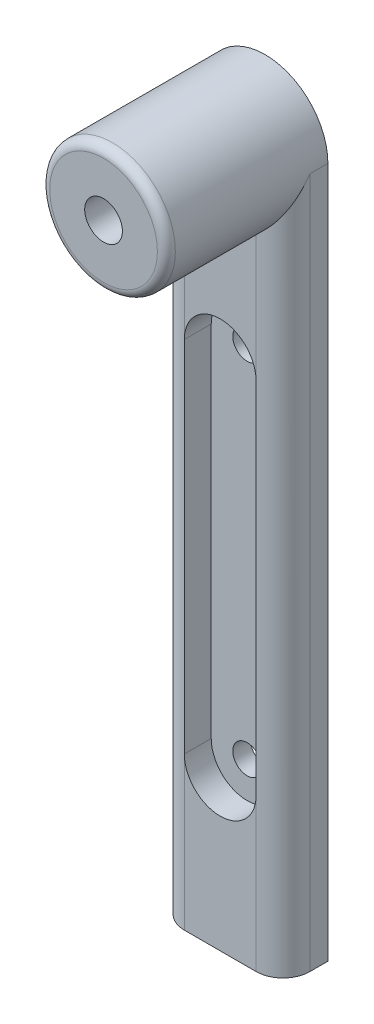
ISO-10303-21;
HEADER;
FILE_DESCRIPTION(('STEP AP214'),'2;1');
FILE_NAME('part.step','',(''),(''),'','','');
FILE_SCHEMA(('AUTOMOTIVE_DESIGN { 1 0 10303 214 1 1 1 1 }'));
ENDSEC;
DATA;
#1=APPLICATION_CONTEXT('core data for automotive mechanical design processes');
#2=APPLICATION_PROTOCOL_DEFINITION('international standard','automotive_design',2000,#1);
#3=PRODUCT_CONTEXT('',#1,'mechanical');
#4=PRODUCT('Part','Part','',(#3));
#5=PRODUCT_RELATED_PRODUCT_CATEGORY('part','',(#4));
#6=PRODUCT_DEFINITION_FORMATION('','',#4);
#7=PRODUCT_DEFINITION_CONTEXT('part definition',#1,'design');
#8=PRODUCT_DEFINITION('design','',#6,#7);
#9=PRODUCT_DEFINITION_SHAPE('','',#8);
#10=(LENGTH_UNIT() NAMED_UNIT(*) SI_UNIT(.MILLI.,.METRE.));
#11=(NAMED_UNIT(*) PLANE_ANGLE_UNIT() SI_UNIT($,.RADIAN.));
#12=(NAMED_UNIT(*) SI_UNIT($,.STERADIAN.) SOLID_ANGLE_UNIT());
#13=UNCERTAINTY_MEASURE_WITH_UNIT(LENGTH_MEASURE(1.E-05),#10,'distance_accuracy_value','');
#14=(GEOMETRIC_REPRESENTATION_CONTEXT(3) GLOBAL_UNCERTAINTY_ASSIGNED_CONTEXT((#13)) GLOBAL_UNIT_ASSIGNED_CONTEXT((#10,
#11,#12)) REPRESENTATION_CONTEXT('',''));
#15=CARTESIAN_POINT('',(0.,0.,0.));
#16=DIRECTION('',(0.,0.,1.));
#17=DIRECTION('',(1.,0.,0.));
#18=AXIS2_PLACEMENT_3D('',#15,#16,#17);
#19=CARTESIAN_POINT('',(0.,0.,5.));
#20=DIRECTION('',(0.,0.,1.));
#21=DIRECTION('',(1.,0.,0.));
#22=AXIS2_PLACEMENT_3D('',#19,#20,#21);
#23=PLANE('',#22);
#24=CARTESIAN_POINT('',(0.,-20.,5.));
#25=DIRECTION('',(0.,0.,1.));
#26=DIRECTION('',(1.,0.,0.));
#27=AXIS2_PLACEMENT_3D('',#24,#25,#26);
#28=CIRCLE('',#27,3.99999999999997);
#29=CARTESIAN_POINT('',(3.99999999999998,-20.,5.));
#30=VERTEX_POINT('',#29);
#31=CARTESIAN_POINT('',(-4.,-20.,5.));
#32=VERTEX_POINT('',#31);
#33=EDGE_CURVE('E54',#30,#32,#28,.T.);
#34=ORIENTED_EDGE('',*,*,#33,.F.);
#35=DIRECTION('',(0.,1.,0.));
#36=VECTOR('',#35,1.);
#37=CARTESIAN_POINT('',(4.,0.,5.));
#38=LINE('',#37,#36);
#39=CARTESIAN_POINT('',(4.,-5.74456264653803,5.));
#40=VERTEX_POINT('',#39);
#41=EDGE_CURVE('E194',#30,#40,#38,.T.);
#42=ORIENTED_EDGE('',*,*,#41,.T.);
#43=CARTESIAN_POINT('',(0.,0.,5.));
#44=DIRECTION('',(0.,0.,1.));
#45=DIRECTION('',(1.,0.,0.));
#46=AXIS2_PLACEMENT_3D('',#43,#44,#45);
#47=CIRCLE('',#46,7.);
#48=CARTESIAN_POINT('',(-4.,-5.74456264653803,5.));
#49=VERTEX_POINT('',#48);
#50=EDGE_CURVE('E187',#49,#40,#47,.T.);
#51=ORIENTED_EDGE('',*,*,#50,.F.);
#52=DIRECTION('',(0.,-1.,0.));
#53=VECTOR('',#52,1.);
#54=CARTESIAN_POINT('',(-3.99999999999999,-77.,5.));
#55=LINE('',#54,#53);
#56=EDGE_CURVE('E191',#49,#32,#55,.T.);
#57=ORIENTED_EDGE('',*,*,#56,.T.);
#58=EDGE_LOOP('',(#34,#42,#51,#57));
#59=FACE_BOUND('',#58,.T.);
#60=ADVANCED_FACE('F39',(#59),#23,.T.);
#61=CARTESIAN_POINT('',(0.,0.,18.));
#62=DIRECTION('',(0.,0.,-1.));
#63=DIRECTION('',(-1.,0.,0.));
#64=AXIS2_PLACEMENT_3D('',#61,#62,#63);
#65=CYLINDRICAL_SURFACE('',#64,7.);
#66=CARTESIAN_POINT('',(0.,0.,17.));
#67=DIRECTION('',(0.,0.,1.));
#68=DIRECTION('',(1.,0.,0.));
#69=AXIS2_PLACEMENT_3D('',#66,#67,#68);
#70=CIRCLE('',#69,7.);
#71=CARTESIAN_POINT('',(7.,0.,17.));
#72=VERTEX_POINT('',#71);
#73=EDGE_CURVE('E11',#72,#72,#70,.F.);
#74=ORIENTED_EDGE('',*,*,#73,.T.);
#75=EDGE_LOOP('',(#74));
#76=FACE_BOUND('',#75,.T.);
#77=DIRECTION('',(0.,0.,-1.));
#78=VECTOR('',#77,1.);
#79=CARTESIAN_POINT('',(-7.,0.,5.));
#80=LINE('',#79,#78);
#81=CARTESIAN_POINT('',(-7.,0.,2.));
#82=VERTEX_POINT('',#81);
#83=CARTESIAN_POINT('',(-7.,0.,0.));
#84=VERTEX_POINT('',#83);
#85=EDGE_CURVE('E168',#82,#84,#80,.T.);
#86=ORIENTED_EDGE('',*,*,#85,.F.);
#87=CARTESIAN_POINT('',(-4.,-5.74456264653803,5.));
#88=CARTESIAN_POINT('',(-4.10560056796325,-5.67106469962434,4.99999204849266));
#89=CARTESIAN_POINT('',(-4.20905142376086,-5.59467720100948,4.99442769333087));
#90=CARTESIAN_POINT('',(-4.41080801779257,-5.43700552068477,4.97346760596443));
#91=CARTESIAN_POINT('',(-4.50912336120114,-5.35573114025841,4.9580909945642));
#92=CARTESIAN_POINT('',(-4.69917329407143,-5.18975480068039,4.91898482455378));
#93=CARTESIAN_POINT('',(-4.79096624771771,-5.10509791169259,4.89534487001315));
#94=CARTESIAN_POINT('',(-4.96884628939413,-4.9321357332573,4.84077401315519));
#95=CARTESIAN_POINT('',(-5.0549297430738,-4.84382817695736,4.8098385229041));
#96=CARTESIAN_POINT('',(-5.24998768852349,-4.6330105694876,4.72986601789085));
#97=CARTESIAN_POINT('',(-5.35656360814947,-4.50924804562533,4.67827055097875));
#98=CARTESIAN_POINT('',(-5.55893618260416,-4.25727146470626,4.5657604340252));
#99=CARTESIAN_POINT('',(-5.65473085178413,-4.12905659330491,4.50484407215645));
#100=CARTESIAN_POINT('',(-5.83621176415536,-3.86833289087036,4.37504527308633));
#101=CARTESIAN_POINT('',(-5.92183863028728,-3.73580409442229,4.30612028884907));
#102=CARTESIAN_POINT('',(-6.08264567432005,-3.46783086204423,4.16200073185211));
#103=CARTESIAN_POINT('',(-6.15782273871987,-3.33238557097271,4.08680430115732));
#104=CARTESIAN_POINT('',(-6.32685567517654,-3.00297512190633,3.89936148940422));
#105=CARTESIAN_POINT('',(-6.41567942504996,-2.80785026043894,3.78459565275172));
#106=CARTESIAN_POINT('',(-6.57392969805323,-2.41422354712003,3.54764095417837));
#107=CARTESIAN_POINT('',(-6.64334692994569,-2.21572012580261,3.42544857062339));
#108=CARTESIAN_POINT('',(-6.76333415409406,-1.81676080636745,3.17605094483991));
#109=CARTESIAN_POINT('',(-6.81393867500258,-1.61630918509485,3.0488553648698));
#110=CARTESIAN_POINT('',(-6.89698633772744,-1.2139797240236,2.79107276025933));
#111=CARTESIAN_POINT('',(-6.92943852375573,-1.01210264530744,2.66048745851133));
#112=CARTESIAN_POINT('',(-6.96842425819762,-0.677380108501033,2.44284499860543));
#113=CARTESIAN_POINT('',(-6.98003745073094,-0.54475385437928,2.35631798354302));
#114=CARTESIAN_POINT('',(-6.99568259306756,-0.279411950065175,2.18291291800331));
#115=CARTESIAN_POINT('',(-6.9997206298678,-0.14669645744637,2.09603520563809));
#116=CARTESIAN_POINT('',(-6.99999533256514,-0.00933330977785251,2.00611008573063));
#117=CARTESIAN_POINT('',(-6.99999999911157,-0.00466664057309183,2.00305503339743));
#118=CARTESIAN_POINT('',(-7.,0.,2.));
#119=B_SPLINE_CURVE_WITH_KNOTS('',3,(#87,#88,#89,#90,#91,#92,#93,#94,#95,#96,#97,#98,#99,#100,
#101,#102,#103,#104,#105,#106,#107,#108,#109,#110,#111,#112,#113,#114,#115,#116,#117,#118),
.UNSPECIFIED.,.F.,.F.,(4,2,2,2,2,2,2,2,2,2,2,2,2,2,2,4),(0.,0.38564717377713,0.770545135607862,
1.15139266981324,1.53248034878109,2.04556248030352,2.55873895518642,3.07477846543134,
3.5909714007265,4.31944082591672,5.04825842465059,5.77573167663153,6.50284214904387,
6.97903025788018,7.45483556281199,7.47156876920095),.UNSPECIFIED.);
#120=EDGE_CURVE('E213',#82,#49,#119,.F.);
#121=ORIENTED_EDGE('',*,*,#120,.T.);
#122=ORIENTED_EDGE('',*,*,#50,.T.);
#123=CARTESIAN_POINT('',(4.,-5.74456264653803,5.));
#124=CARTESIAN_POINT('',(4.10560056796326,-5.67106469962434,4.99999204849266));
#125=CARTESIAN_POINT('',(4.20905142376086,-5.59467720100947,4.99442769333087));
#126=CARTESIAN_POINT('',(4.41080801779257,-5.43700552068477,4.97346760596443));
#127=CARTESIAN_POINT('',(4.50912336120114,-5.35573114025841,4.9580909945642));
#128=CARTESIAN_POINT('',(4.69917329407143,-5.18975480068039,4.91898482455378));
#129=CARTESIAN_POINT('',(4.79096624771772,-5.10509791169259,4.89534487001315));
#130=CARTESIAN_POINT('',(4.96884628939413,-4.9321357332573,4.84077401315519));
#131=CARTESIAN_POINT('',(5.0549297430738,-4.84382817695736,4.8098385229041));
#132=CARTESIAN_POINT('',(5.24998768852349,-4.6330105694876,4.72986601789085));
#133=CARTESIAN_POINT('',(5.35656360814947,-4.50924804562533,4.67827055097875));
#134=CARTESIAN_POINT('',(5.55893618260416,-4.25727146470626,4.5657604340252));
#135=CARTESIAN_POINT('',(5.65473085178413,-4.12905659330491,4.50484407215645));
#136=CARTESIAN_POINT('',(5.83621176415536,-3.86833289087036,4.37504527308633));
#137=CARTESIAN_POINT('',(5.92183863028728,-3.73580409442229,4.30612028884907));
#138=CARTESIAN_POINT('',(6.08264567432005,-3.46783086204423,4.16200073185211));
#139=CARTESIAN_POINT('',(6.15782273871987,-3.33238557097271,4.08680430115732));
#140=CARTESIAN_POINT('',(6.32685567517654,-3.00297512190633,3.89936148940423));
#141=CARTESIAN_POINT('',(6.41567942504996,-2.80785026043894,3.78459565275172));
#142=CARTESIAN_POINT('',(6.57392969805323,-2.41422354712003,3.54764095417837));
#143=CARTESIAN_POINT('',(6.64334692994569,-2.21572012580261,3.42544857062339));
#144=CARTESIAN_POINT('',(6.76333415409406,-1.81676080636745,3.17605094483991));
#145=CARTESIAN_POINT('',(6.81393867500258,-1.61630918509485,3.04885536486981));
#146=CARTESIAN_POINT('',(6.89698633772744,-1.2139797240236,2.79107276025933));
#147=CARTESIAN_POINT('',(6.92943852375573,-1.01210264530744,2.66048745851133));
#148=CARTESIAN_POINT('',(6.96842425819762,-0.677380108501032,2.44284499860543));
#149=CARTESIAN_POINT('',(6.98003745073094,-0.544753854379276,2.35631798354303));
#150=CARTESIAN_POINT('',(6.99568259306756,-0.27941195006518,2.1829129180033));
#151=CARTESIAN_POINT('',(6.9997206298678,-0.146696457446387,2.09603520563806));
#152=CARTESIAN_POINT('',(6.99999533256514,-0.00933330977785193,2.00611008573063));
#153=CARTESIAN_POINT('',(6.99999999911157,-0.00466664057309069,2.00305503339743));
#154=CARTESIAN_POINT('',(7.,0.,2.));
#155=B_SPLINE_CURVE_WITH_KNOTS('',3,(#123,#124,#125,#126,#127,#128,#129,#130,#131,#132,#133,
#134,#135,#136,#137,#138,#139,#140,#141,#142,#143,#144,#145,#146,#147,#148,#149,#150,#151,#152,
#153,#154),.UNSPECIFIED.,.F.,.F.,(4,2,2,2,2,2,2,2,2,2,2,2,2,2,2,4),(0.,0.38564717377713,
0.770545135607862,1.15139266981324,1.53248034878109,2.04556248030352,2.55873895518642,
3.07477846543134,3.5909714007265,4.31944082591671,5.04825842465059,5.77573167663153,
6.50284214904387,6.97903025788018,7.45483556281199,7.47156876920095),.UNSPECIFIED.);
#156=CARTESIAN_POINT('',(7.,0.,2.));
#157=VERTEX_POINT('',#156);
#158=EDGE_CURVE('E205',#40,#157,#155,.T.);
#159=ORIENTED_EDGE('',*,*,#158,.T.);
#160=DIRECTION('',(0.,0.,-1.));
#161=VECTOR('',#160,1.);
#162=CARTESIAN_POINT('',(7.,0.,5.));
#163=LINE('',#162,#161);
#164=CARTESIAN_POINT('',(7.,0.,0.));
#165=VERTEX_POINT('',#164);
#166=EDGE_CURVE('E178',#157,#165,#163,.T.);
#167=ORIENTED_EDGE('',*,*,#166,.T.);
#168=CARTESIAN_POINT('',(0.,0.,0.));
#169=DIRECTION('',(0.,0.,1.));
#170=DIRECTION('',(1.,0.,0.));
#171=AXIS2_PLACEMENT_3D('',#168,#169,#170);
#172=CIRCLE('',#171,7.);
#173=EDGE_CURVE('E184',#165,#84,#172,.T.);
#174=ORIENTED_EDGE('',*,*,#173,.T.);
#175=EDGE_LOOP('',(#86,#121,#122,#159,#167,#174));
#176=FACE_BOUND('',#175,.T.);
#177=ADVANCED_FACE('F218',(#76,#176),#65,.T.);
#178=CARTESIAN_POINT('',(0.,0.,18.));
#179=DIRECTION('',(0.,0.,1.));
#180=DIRECTION('',(1.,0.,0.));
#181=AXIS2_PLACEMENT_3D('',#178,#179,#180);
#182=PLANE('',#181);
#183=CARTESIAN_POINT('',(0.,0.,18.));
#184=DIRECTION('',(0.,0.,1.));
#185=DIRECTION('',(1.,0.,0.));
#186=AXIS2_PLACEMENT_3D('',#183,#184,#185);
#187=CIRCLE('',#186,6.);
#188=CARTESIAN_POINT('',(6.,0.,18.));
#189=VERTEX_POINT('',#188);
#190=EDGE_CURVE('E47',#189,#189,#187,.T.);
#191=ORIENTED_EDGE('',*,*,#190,.T.);
#192=EDGE_LOOP('',(#191));
#193=FACE_BOUND('',#192,.T.);
#194=CARTESIAN_POINT('',(0.,0.,18.));
#195=DIRECTION('',(0.,0.,1.));
#196=DIRECTION('',(1.,0.,0.));
#197=AXIS2_PLACEMENT_3D('',#194,#195,#196);
#198=CIRCLE('',#197,2.1);
#199=CARTESIAN_POINT('',(2.1,0.,18.));
#200=VERTEX_POINT('',#199);
#201=EDGE_CURVE('E155',#200,#200,#198,.T.);
#202=ORIENTED_EDGE('',*,*,#201,.F.);
#203=EDGE_LOOP('',(#202));
#204=FACE_BOUND('',#203,.T.);
#205=ADVANCED_FACE('F243',(#193,#204),#182,.T.);
#206=CARTESIAN_POINT('',(0.,0.,0.));
#207=DIRECTION('',(0.,0.,1.));
#208=DIRECTION('',(1.,0.,0.));
#209=AXIS2_PLACEMENT_3D('',#206,#207,#208);
#210=PLANE('',#209);
#211=CARTESIAN_POINT('',(0.,-20.,0.));
#212=DIRECTION('',(0.,0.,1.));
#213=DIRECTION('',(1.,0.,0.));
#214=AXIS2_PLACEMENT_3D('',#211,#212,#213);
#215=CIRCLE('',#214,1.6);
#216=CARTESIAN_POINT('',(1.59999999999999,-20.,0.));
#217=VERTEX_POINT('',#216);
#218=EDGE_CURVE('E143',#217,#217,#215,.T.);
#219=ORIENTED_EDGE('',*,*,#218,.T.);
#220=EDGE_LOOP('',(#219));
#221=FACE_BOUND('',#220,.T.);
#222=CARTESIAN_POINT('',(0.,-60.,0.));
#223=DIRECTION('',(0.,0.,1.));
#224=DIRECTION('',(1.,0.,0.));
#225=AXIS2_PLACEMENT_3D('',#222,#223,#224);
#226=CIRCLE('',#225,1.6);
#227=CARTESIAN_POINT('',(1.59999999999999,-60.,0.));
#228=VERTEX_POINT('',#227);
#229=EDGE_CURVE('E425',#228,#228,#226,.T.);
#230=ORIENTED_EDGE('',*,*,#229,.T.);
#231=EDGE_LOOP('',(#230));
#232=FACE_BOUND('',#231,.T.);
#233=CARTESIAN_POINT('',(0.,0.,0.));
#234=DIRECTION('',(0.,0.,1.));
#235=DIRECTION('',(1.,0.,0.));
#236=AXIS2_PLACEMENT_3D('',#233,#234,#235);
#237=CIRCLE('',#236,2.1);
#238=CARTESIAN_POINT('',(2.1,0.,0.));
#239=VERTEX_POINT('',#238);
#240=EDGE_CURVE('E159',#239,#239,#237,.T.);
#241=ORIENTED_EDGE('',*,*,#240,.T.);
#242=EDGE_LOOP('',(#241));
#243=FACE_BOUND('',#242,.T.);
#244=ORIENTED_EDGE('',*,*,#173,.F.);
#245=DIRECTION('',(0.,1.,0.));
#246=VECTOR('',#245,1.);
#247=CARTESIAN_POINT('',(7.,0.,0.));
#248=LINE('',#247,#246);
#249=CARTESIAN_POINT('',(7.00000000000001,-77.,0.));
#250=VERTEX_POINT('',#249);
#251=EDGE_CURVE('E169',#250,#165,#248,.T.);
#252=ORIENTED_EDGE('',*,*,#251,.F.);
#253=DIRECTION('',(1.,0.,0.));
#254=VECTOR('',#253,1.);
#255=CARTESIAN_POINT('',(-6.99999999999999,-77.,0.));
#256=LINE('',#255,#254);
#257=CARTESIAN_POINT('',(-6.99999999999999,-77.,0.));
#258=VERTEX_POINT('',#257);
#259=EDGE_CURVE('E172',#258,#250,#256,.T.);
#260=ORIENTED_EDGE('',*,*,#259,.F.);
#261=DIRECTION('',(0.,-1.,0.));
#262=VECTOR('',#261,1.);
#263=CARTESIAN_POINT('',(-7.,0.,0.));
#264=LINE('',#263,#262);
#265=EDGE_CURVE('E162',#84,#258,#264,.T.);
#266=ORIENTED_EDGE('',*,*,#265,.F.);
#267=EDGE_LOOP('',(#244,#252,#260,#266));
#268=FACE_BOUND('',#267,.T.);
#269=ADVANCED_FACE('F294',(#221,#232,#243,#268),#210,.F.);
#270=CARTESIAN_POINT('',(-7.,0.,5.));
#271=DIRECTION('',(1.,0.,0.));
#272=DIRECTION('',(0.,1.,0.));
#273=AXIS2_PLACEMENT_3D('',#270,#271,#272);
#274=PLANE('',#273);
#275=DIRECTION('',(0.,0.,-1.));
#276=VECTOR('',#275,1.);
#277=CARTESIAN_POINT('',(-6.99999999999999,-77.,5.));
#278=LINE('',#277,#276);
#279=CARTESIAN_POINT('',(-6.99999999999999,-77.,2.));
#280=VERTEX_POINT('',#279);
#281=EDGE_CURVE('E182',#280,#258,#278,.T.);
#282=ORIENTED_EDGE('',*,*,#281,.F.);
#283=DIRECTION('',(0.,-1.,0.));
#284=VECTOR('',#283,1.);
#285=CARTESIAN_POINT('',(-7.,0.,2.));
#286=LINE('',#285,#284);
#287=EDGE_CURVE('E62',#280,#82,#286,.F.);
#288=ORIENTED_EDGE('',*,*,#287,.T.);
#289=ORIENTED_EDGE('',*,*,#85,.T.);
#290=ORIENTED_EDGE('',*,*,#265,.T.);
#291=EDGE_LOOP('',(#282,#288,#289,#290));
#292=FACE_BOUND('',#291,.T.);
#293=ADVANCED_FACE('F291',(#292),#274,.F.);
#294=CARTESIAN_POINT('',(-6.99999999999999,-77.,5.));
#295=DIRECTION('',(0.,1.,0.));
#296=DIRECTION('',(0.,0.,1.));
#297=AXIS2_PLACEMENT_3D('',#294,#295,#296);
#298=PLANE('',#297);
#299=DIRECTION('',(0.,0.,-1.));
#300=VECTOR('',#299,1.);
#301=CARTESIAN_POINT('',(7.00000000000001,-77.,5.));
#302=LINE('',#301,#300);
#303=CARTESIAN_POINT('',(7.00000000000001,-77.,2.));
#304=VERTEX_POINT('',#303);
#305=EDGE_CURVE('E180',#304,#250,#302,.T.);
#306=ORIENTED_EDGE('',*,*,#305,.F.);
#307=CARTESIAN_POINT('',(4.00000000000001,-77.,2.));
#308=DIRECTION('',(0.,1.,0.));
#309=DIRECTION('',(0.,0.,1.));
#310=AXIS2_PLACEMENT_3D('',#307,#308,#309);
#311=CIRCLE('',#310,3.);
#312=CARTESIAN_POINT('',(4.00000000000001,-77.,5.));
#313=VERTEX_POINT('',#312);
#314=EDGE_CURVE('E202',#304,#313,#311,.F.);
#315=ORIENTED_EDGE('',*,*,#314,.T.);
#316=DIRECTION('',(1.,0.,0.));
#317=VECTOR('',#316,1.);
#318=CARTESIAN_POINT('',(-6.99999999999999,-77.,5.));
#319=LINE('',#318,#317);
#320=CARTESIAN_POINT('',(-3.99999999999999,-77.,5.));
#321=VERTEX_POINT('',#320);
#322=EDGE_CURVE('E165',#321,#313,#319,.T.);
#323=ORIENTED_EDGE('',*,*,#322,.F.);
#324=CARTESIAN_POINT('',(-3.99999999999999,-77.,2.));
#325=DIRECTION('',(0.,1.,0.));
#326=DIRECTION('',(0.,0.,1.));
#327=AXIS2_PLACEMENT_3D('',#324,#325,#326);
#328=CIRCLE('',#327,3.);
#329=EDGE_CURVE('E200',#321,#280,#328,.F.);
#330=ORIENTED_EDGE('',*,*,#329,.T.);
#331=ORIENTED_EDGE('',*,*,#281,.T.);
#332=ORIENTED_EDGE('',*,*,#259,.T.);
#333=EDGE_LOOP('',(#306,#315,#323,#330,#331,#332));
#334=FACE_BOUND('',#333,.T.);
#335=ADVANCED_FACE('F255',(#334),#298,.F.);
#336=CARTESIAN_POINT('',(7.,0.,5.));
#337=DIRECTION('',(-1.,0.,0.));
#338=DIRECTION('',(0.,-1.,0.));
#339=AXIS2_PLACEMENT_3D('',#336,#337,#338);
#340=PLANE('',#339);
#341=ORIENTED_EDGE('',*,*,#166,.F.);
#342=DIRECTION('',(0.,1.,0.));
#343=VECTOR('',#342,1.);
#344=CARTESIAN_POINT('',(7.00000000000001,-77.,2.));
#345=LINE('',#344,#343);
#346=EDGE_CURVE('E198',#157,#304,#345,.F.);
#347=ORIENTED_EDGE('',*,*,#346,.T.);
#348=ORIENTED_EDGE('',*,*,#305,.T.);
#349=ORIENTED_EDGE('',*,*,#251,.T.);
#350=EDGE_LOOP('',(#341,#347,#348,#349));
#351=FACE_BOUND('',#350,.T.);
#352=ADVANCED_FACE('F248',(#351),#340,.F.);
#353=CARTESIAN_POINT('',(0.,-60.,5.));
#354=DIRECTION('',(0.,0.,1.));
#355=DIRECTION('',(1.,0.,0.));
#356=AXIS2_PLACEMENT_3D('',#353,#354,#355);
#357=CIRCLE('',#356,3.99999999999997);
#358=CARTESIAN_POINT('',(-3.99999999999999,-60.,5.));
#359=VERTEX_POINT('',#358);
#360=CARTESIAN_POINT('',(3.99999999999998,-60.,5.));
#361=VERTEX_POINT('',#360);
#362=EDGE_CURVE('E140',#359,#361,#357,.T.);
#363=ORIENTED_EDGE('',*,*,#362,.F.);
#364=EDGE_CURVE('E190',#359,#321,#55,.T.);
#365=ORIENTED_EDGE('',*,*,#364,.T.);
#366=ORIENTED_EDGE('',*,*,#322,.T.);
#367=EDGE_CURVE('E195',#313,#361,#38,.T.);
#368=ORIENTED_EDGE('',*,*,#367,.T.);
#369=EDGE_LOOP('',(#363,#365,#366,#368));
#370=FACE_BOUND('',#369,.T.);
#371=ADVANCED_FACE('F239',(#370),#23,.T.);
#372=CARTESIAN_POINT('',(0.,0.,0.));
#373=DIRECTION('',(0.,0.,1.));
#374=DIRECTION('',(1.,0.,0.));
#375=AXIS2_PLACEMENT_3D('',#372,#373,#374);
#376=CYLINDRICAL_SURFACE('',#375,2.1);
#377=ORIENTED_EDGE('',*,*,#240,.F.);
#378=EDGE_LOOP('',(#377));
#379=FACE_BOUND('',#378,.T.);
#380=ORIENTED_EDGE('',*,*,#201,.T.);
#381=EDGE_LOOP('',(#380));
#382=FACE_BOUND('',#381,.T.);
#383=ADVANCED_FACE('F225',(#379,#382),#376,.F.);
#384=CARTESIAN_POINT('',(4.,0.,2.));
#385=DIRECTION('',(0.,-1.,0.));
#386=DIRECTION('',(1.,0.,0.));
#387=AXIS2_PLACEMENT_3D('',#384,#385,#386);
#388=CYLINDRICAL_SURFACE('',#387,3.);
#389=ORIENTED_EDGE('',*,*,#314,.F.);
#390=ORIENTED_EDGE('',*,*,#346,.F.);
#391=ORIENTED_EDGE('',*,*,#158,.F.);
#392=ORIENTED_EDGE('',*,*,#41,.F.);
#393=DIRECTION('',(0.,1.,0.));
#394=VECTOR('',#393,1.);
#395=CARTESIAN_POINT('',(3.99999999999998,-20.,5.));
#396=LINE('',#395,#394);
#397=EDGE_CURVE('E137',#361,#30,#396,.T.);
#398=ORIENTED_EDGE('',*,*,#397,.F.);
#399=ORIENTED_EDGE('',*,*,#367,.F.);
#400=EDGE_LOOP('',(#389,#390,#391,#392,#398,#399));
#401=FACE_BOUND('',#400,.T.);
#402=ADVANCED_FACE('F221',(#401),#388,.T.);
#403=CARTESIAN_POINT('',(-4.,0.,2.));
#404=DIRECTION('',(0.,1.,0.));
#405=DIRECTION('',(-1.,0.,0.));
#406=AXIS2_PLACEMENT_3D('',#403,#404,#405);
#407=CYLINDRICAL_SURFACE('',#406,3.);
#408=ORIENTED_EDGE('',*,*,#120,.F.);
#409=ORIENTED_EDGE('',*,*,#287,.F.);
#410=ORIENTED_EDGE('',*,*,#329,.F.);
#411=ORIENTED_EDGE('',*,*,#364,.F.);
#412=DIRECTION('',(0.,-1.,0.));
#413=VECTOR('',#412,1.);
#414=CARTESIAN_POINT('',(-3.99999999999996,-20.,5.));
#415=LINE('',#414,#413);
#416=EDGE_CURVE('E149',#32,#359,#415,.T.);
#417=ORIENTED_EDGE('',*,*,#416,.F.);
#418=ORIENTED_EDGE('',*,*,#56,.F.);
#419=EDGE_LOOP('',(#408,#409,#410,#411,#417,#418));
#420=FACE_BOUND('',#419,.T.);
#421=ADVANCED_FACE('F224',(#420),#407,.T.);
#422=CARTESIAN_POINT('',(0.,-20.,2.));
#423=DIRECTION('',(0.,0.,1.));
#424=DIRECTION('',(1.,0.,0.));
#425=AXIS2_PLACEMENT_3D('',#422,#423,#424);
#426=CYLINDRICAL_SURFACE('',#425,3.99999999999997);
#427=ORIENTED_EDGE('',*,*,#33,.T.);
#428=DIRECTION('',(0.,0.,1.));
#429=VECTOR('',#428,1.);
#430=CARTESIAN_POINT('',(-3.99999999999996,-20.,2.));
#431=LINE('',#430,#429);
#432=CARTESIAN_POINT('',(-3.99999999999996,-20.,2.));
#433=VERTEX_POINT('',#432);
#434=EDGE_CURVE('E115',#433,#32,#431,.T.);
#435=ORIENTED_EDGE('',*,*,#434,.F.);
#436=CARTESIAN_POINT('',(0.,-20.,2.));
#437=DIRECTION('',(0.,0.,1.));
#438=DIRECTION('',(1.,0.,0.));
#439=AXIS2_PLACEMENT_3D('',#436,#437,#438);
#440=CIRCLE('',#439,3.99999999999997);
#441=CARTESIAN_POINT('',(3.99999999999998,-20.,2.));
#442=VERTEX_POINT('',#441);
#443=EDGE_CURVE('E119',#442,#433,#440,.T.);
#444=ORIENTED_EDGE('',*,*,#443,.F.);
#445=DIRECTION('',(0.,0.,1.));
#446=VECTOR('',#445,1.);
#447=CARTESIAN_POINT('',(3.99999999999998,-20.,2.));
#448=LINE('',#447,#446);
#449=EDGE_CURVE('E153',#442,#30,#448,.T.);
#450=ORIENTED_EDGE('',*,*,#449,.T.);
#451=EDGE_LOOP('',(#427,#435,#444,#450));
#452=FACE_BOUND('',#451,.T.);
#453=ADVANCED_FACE('F117',(#452),#426,.F.);
#454=CARTESIAN_POINT('',(3.99999999999998,-20.,2.));
#455=DIRECTION('',(1.,0.,0.));
#456=DIRECTION('',(0.,1.,0.));
#457=AXIS2_PLACEMENT_3D('',#454,#455,#456);
#458=PLANE('',#457);
#459=ORIENTED_EDGE('',*,*,#397,.T.);
#460=ORIENTED_EDGE('',*,*,#449,.F.);
#461=DIRECTION('',(0.,1.,0.));
#462=VECTOR('',#461,1.);
#463=CARTESIAN_POINT('',(3.99999999999998,-20.,2.));
#464=LINE('',#463,#462);
#465=CARTESIAN_POINT('',(3.99999999999998,-60.,2.));
#466=VERTEX_POINT('',#465);
#467=EDGE_CURVE('E125',#466,#442,#464,.T.);
#468=ORIENTED_EDGE('',*,*,#467,.F.);
#469=DIRECTION('',(0.,0.,1.));
#470=VECTOR('',#469,1.);
#471=CARTESIAN_POINT('',(3.99999999999998,-60.,2.));
#472=LINE('',#471,#470);
#473=EDGE_CURVE('E156',#466,#361,#472,.T.);
#474=ORIENTED_EDGE('',*,*,#473,.T.);
#475=EDGE_LOOP('',(#459,#460,#468,#474));
#476=FACE_BOUND('',#475,.T.);
#477=ADVANCED_FACE('F233',(#476),#458,.F.);
#478=CARTESIAN_POINT('',(0.,-60.,2.));
#479=DIRECTION('',(0.,0.,1.));
#480=DIRECTION('',(1.,0.,0.));
#481=AXIS2_PLACEMENT_3D('',#478,#479,#480);
#482=CYLINDRICAL_SURFACE('',#481,3.99999999999997);
#483=ORIENTED_EDGE('',*,*,#362,.T.);
#484=ORIENTED_EDGE('',*,*,#473,.F.);
#485=CARTESIAN_POINT('',(0.,-60.,2.));
#486=DIRECTION('',(0.,0.,1.));
#487=DIRECTION('',(1.,0.,0.));
#488=AXIS2_PLACEMENT_3D('',#485,#486,#487);
#489=CIRCLE('',#488,3.99999999999997);
#490=CARTESIAN_POINT('',(-3.99999999999999,-60.,2.));
#491=VERTEX_POINT('',#490);
#492=EDGE_CURVE('E133',#491,#466,#489,.T.);
#493=ORIENTED_EDGE('',*,*,#492,.F.);
#494=DIRECTION('',(0.,0.,1.));
#495=VECTOR('',#494,1.);
#496=CARTESIAN_POINT('',(-3.99999999999999,-60.,2.));
#497=LINE('',#496,#495);
#498=EDGE_CURVE('E124',#491,#359,#497,.T.);
#499=ORIENTED_EDGE('',*,*,#498,.T.);
#500=EDGE_LOOP('',(#483,#484,#493,#499));
#501=FACE_BOUND('',#500,.T.);
#502=ADVANCED_FACE('F351',(#501),#482,.F.);
#503=CARTESIAN_POINT('',(-3.99999999999996,-20.,2.));
#504=DIRECTION('',(-1.,0.,0.));
#505=DIRECTION('',(0.,-1.,0.));
#506=AXIS2_PLACEMENT_3D('',#503,#504,#505);
#507=PLANE('',#506);
#508=ORIENTED_EDGE('',*,*,#416,.T.);
#509=ORIENTED_EDGE('',*,*,#498,.F.);
#510=DIRECTION('',(0.,-1.,0.));
#511=VECTOR('',#510,1.);
#512=CARTESIAN_POINT('',(-3.99999999999996,-20.,2.));
#513=LINE('',#512,#511);
#514=EDGE_CURVE('E128',#433,#491,#513,.T.);
#515=ORIENTED_EDGE('',*,*,#514,.F.);
#516=ORIENTED_EDGE('',*,*,#434,.T.);
#517=EDGE_LOOP('',(#508,#509,#515,#516));
#518=FACE_BOUND('',#517,.T.);
#519=ADVANCED_FACE('F129',(#518),#507,.F.);
#520=CARTESIAN_POINT('',(0.,-20.,2.));
#521=DIRECTION('',(0.,0.,1.));
#522=DIRECTION('',(1.,0.,0.));
#523=AXIS2_PLACEMENT_3D('',#520,#521,#522);
#524=PLANE('',#523);
#525=CARTESIAN_POINT('',(0.,-20.,2.));
#526=DIRECTION('',(0.,0.,1.));
#527=DIRECTION('',(1.,0.,0.));
#528=AXIS2_PLACEMENT_3D('',#525,#526,#527);
#529=CIRCLE('',#528,1.6);
#530=CARTESIAN_POINT('',(1.59999999999999,-20.,2.));
#531=VERTEX_POINT('',#530);
#532=EDGE_CURVE('E426',#531,#531,#529,.T.);
#533=ORIENTED_EDGE('',*,*,#532,.F.);
#534=EDGE_LOOP('',(#533));
#535=FACE_BOUND('',#534,.T.);
#536=CARTESIAN_POINT('',(0.,-60.,2.));
#537=DIRECTION('',(0.,0.,1.));
#538=DIRECTION('',(1.,0.,0.));
#539=AXIS2_PLACEMENT_3D('',#536,#537,#538);
#540=CIRCLE('',#539,1.6);
#541=CARTESIAN_POINT('',(1.59999999999999,-60.,2.));
#542=VERTEX_POINT('',#541);
#543=EDGE_CURVE('E422',#542,#542,#540,.T.);
#544=ORIENTED_EDGE('',*,*,#543,.F.);
#545=EDGE_LOOP('',(#544));
#546=FACE_BOUND('',#545,.T.);
#547=ORIENTED_EDGE('',*,*,#443,.T.);
#548=ORIENTED_EDGE('',*,*,#514,.T.);
#549=ORIENTED_EDGE('',*,*,#492,.T.);
#550=ORIENTED_EDGE('',*,*,#467,.T.);
#551=EDGE_LOOP('',(#547,#548,#549,#550));
#552=FACE_BOUND('',#551,.T.);
#553=ADVANCED_FACE('F135',(#535,#546,#552),#524,.T.);
#554=CARTESIAN_POINT('',(0.,-60.,-1.));
#555=DIRECTION('',(0.,0.,1.));
#556=DIRECTION('',(1.,0.,0.));
#557=AXIS2_PLACEMENT_3D('',#554,#555,#556);
#558=CYLINDRICAL_SURFACE('',#557,1.6);
#559=ORIENTED_EDGE('',*,*,#543,.T.);
#560=EDGE_LOOP('',(#559));
#561=FACE_BOUND('',#560,.T.);
#562=ORIENTED_EDGE('',*,*,#229,.F.);
#563=EDGE_LOOP('',(#562));
#564=FACE_BOUND('',#563,.T.);
#565=ADVANCED_FACE('F285',(#561,#564),#558,.F.);
#566=CARTESIAN_POINT('',(0.,-20.,-1.));
#567=DIRECTION('',(0.,0.,1.));
#568=DIRECTION('',(1.,0.,0.));
#569=AXIS2_PLACEMENT_3D('',#566,#567,#568);
#570=CYLINDRICAL_SURFACE('',#569,1.6);
#571=ORIENTED_EDGE('',*,*,#532,.T.);
#572=EDGE_LOOP('',(#571));
#573=FACE_BOUND('',#572,.T.);
#574=ORIENTED_EDGE('',*,*,#218,.F.);
#575=EDGE_LOOP('',(#574));
#576=FACE_BOUND('',#575,.T.);
#577=ADVANCED_FACE('F280',(#573,#576),#570,.F.);
#578=CARTESIAN_POINT('',(0.,0.,17.));
#579=DIRECTION('',(0.,0.,1.));
#580=DIRECTION('',(1.,0.,0.));
#581=AXIS2_PLACEMENT_3D('',#578,#579,#580);
#582=TOROIDAL_SURFACE('',#581,6.,1.);
#583=ORIENTED_EDGE('',*,*,#73,.F.);
#584=EDGE_LOOP('',(#583));
#585=FACE_BOUND('',#584,.T.);
#586=ORIENTED_EDGE('',*,*,#190,.F.);
#587=EDGE_LOOP('',(#586));
#588=FACE_BOUND('',#587,.T.);
#589=ADVANCED_FACE('F41',(#585,#588),#582,.T.);
#590=CLOSED_SHELL('',(#60,#177,#205,#269,#293,#335,#352,#371,#383,#402,#421,#453,#477,#502,#519,
#553,#565,#577,#589));
#591=MANIFOLD_SOLID_BREP('B2',#590);
#592=ADVANCED_BREP_SHAPE_REPRESENTATION('',(#18,#591),#14);
#593=SHAPE_DEFINITION_REPRESENTATION(#9,#592);
ENDSEC;
END-ISO-10303-21;
